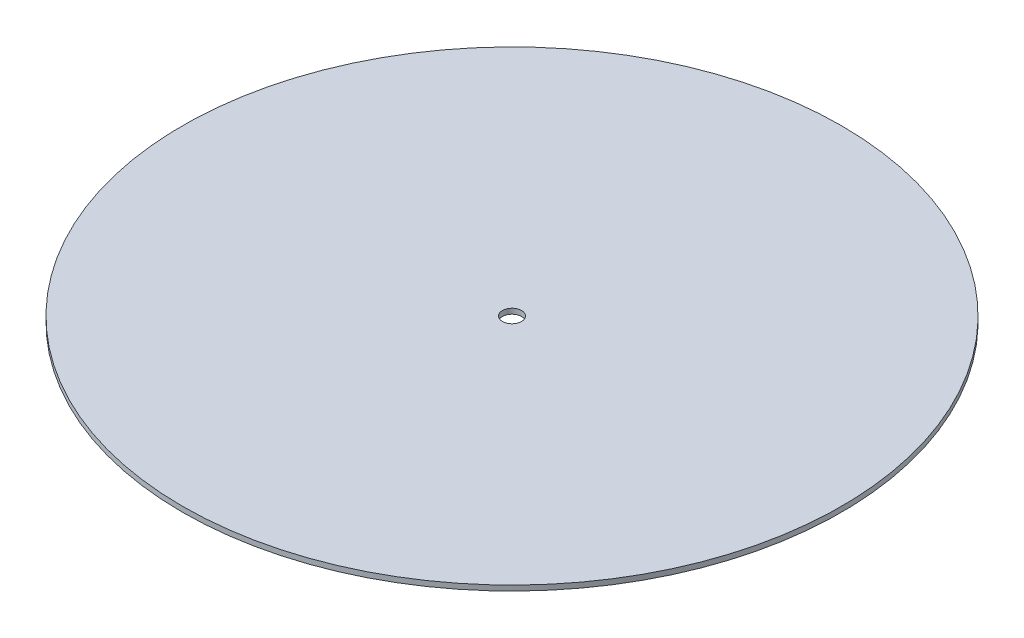
ISO-10303-21;
HEADER;
FILE_DESCRIPTION(('STEP AP214'),'2;1');
FILE_NAME('part.step','',(''),(''),'','','');
FILE_SCHEMA(('AUTOMOTIVE_DESIGN { 1 0 10303 214 1 1 1 1 }'));
ENDSEC;
DATA;
#1=APPLICATION_CONTEXT('core data for automotive mechanical design processes');
#2=APPLICATION_PROTOCOL_DEFINITION('international standard','automotive_design',2000,#1);
#3=PRODUCT_CONTEXT('',#1,'mechanical');
#4=PRODUCT('Part','Part','',(#3));
#5=PRODUCT_RELATED_PRODUCT_CATEGORY('part','',(#4));
#6=PRODUCT_DEFINITION_FORMATION('','',#4);
#7=PRODUCT_DEFINITION_CONTEXT('part definition',#1,'design');
#8=PRODUCT_DEFINITION('design','',#6,#7);
#9=PRODUCT_DEFINITION_SHAPE('','',#8);
#10=(LENGTH_UNIT() NAMED_UNIT(*) SI_UNIT(.MILLI.,.METRE.));
#11=(NAMED_UNIT(*) PLANE_ANGLE_UNIT() SI_UNIT($,.RADIAN.));
#12=(NAMED_UNIT(*) SI_UNIT($,.STERADIAN.) SOLID_ANGLE_UNIT());
#13=UNCERTAINTY_MEASURE_WITH_UNIT(LENGTH_MEASURE(1.E-05),#10,'distance_accuracy_value','');
#14=(GEOMETRIC_REPRESENTATION_CONTEXT(3) GLOBAL_UNCERTAINTY_ASSIGNED_CONTEXT((#13)) GLOBAL_UNIT_ASSIGNED_CONTEXT((#10,
#11,#12)) REPRESENTATION_CONTEXT('',''));
#15=CARTESIAN_POINT('',(0.,0.,0.));
#16=DIRECTION('',(0.,0.,1.));
#17=DIRECTION('',(1.,0.,0.));
#18=AXIS2_PLACEMENT_3D('',#15,#16,#17);
#19=CARTESIAN_POINT('',(0.,3.,0.));
#20=DIRECTION('',(0.,-1.,0.));
#21=DIRECTION('',(0.,0.,-1.));
#22=AXIS2_PLACEMENT_3D('',#19,#20,#21);
#23=CYLINDRICAL_SURFACE('',#22,190.);
#24=CARTESIAN_POINT('',(0.,3.,0.));
#25=DIRECTION('',(0.,1.,0.));
#26=DIRECTION('',(0.,0.,1.));
#27=AXIS2_PLACEMENT_3D('',#24,#25,#26);
#28=CIRCLE('',#27,190.);
#29=CARTESIAN_POINT('',(0.,3.,190.));
#30=VERTEX_POINT('',#29);
#31=EDGE_CURVE('E10',#30,#30,#28,.T.);
#32=ORIENTED_EDGE('',*,*,#31,.F.);
#33=EDGE_LOOP('',(#32));
#34=FACE_BOUND('',#33,.T.);
#35=CARTESIAN_POINT('',(0.,0.,0.));
#36=DIRECTION('',(0.,1.,0.));
#37=DIRECTION('',(0.,0.,1.));
#38=AXIS2_PLACEMENT_3D('',#35,#36,#37);
#39=CIRCLE('',#38,190.);
#40=CARTESIAN_POINT('',(0.,0.,190.));
#41=VERTEX_POINT('',#40);
#42=EDGE_CURVE('E36',#41,#41,#39,.T.);
#43=ORIENTED_EDGE('',*,*,#42,.T.);
#44=EDGE_LOOP('',(#43));
#45=FACE_BOUND('',#44,.T.);
#46=ADVANCED_FACE('F33',(#34,#45),#23,.T.);
#47=CARTESIAN_POINT('',(0.,3.,0.));
#48=DIRECTION('',(0.,1.,0.));
#49=DIRECTION('',(0.,0.,1.));
#50=AXIS2_PLACEMENT_3D('',#47,#48,#49);
#51=PLANE('',#50);
#52=CARTESIAN_POINT('',(0.,3.,0.));
#53=DIRECTION('',(0.,1.,0.));
#54=DIRECTION('',(0.,0.,1.));
#55=AXIS2_PLACEMENT_3D('',#52,#53,#54);
#56=CIRCLE('',#55,5.5);
#57=CARTESIAN_POINT('',(0.,3.,5.5));
#58=VERTEX_POINT('',#57);
#59=EDGE_CURVE('E47',#58,#58,#56,.T.);
#60=ORIENTED_EDGE('',*,*,#59,.F.);
#61=EDGE_LOOP('',(#60));
#62=FACE_BOUND('',#61,.T.);
#63=ORIENTED_EDGE('',*,*,#31,.T.);
#64=EDGE_LOOP('',(#63));
#65=FACE_BOUND('',#64,.T.);
#66=ADVANCED_FACE('F53',(#62,#65),#51,.T.);
#67=CARTESIAN_POINT('',(0.,0.,0.));
#68=DIRECTION('',(0.,1.,0.));
#69=DIRECTION('',(0.,0.,1.));
#70=AXIS2_PLACEMENT_3D('',#67,#68,#69);
#71=PLANE('',#70);
#72=CARTESIAN_POINT('',(0.,0.,0.));
#73=DIRECTION('',(0.,1.,0.));
#74=DIRECTION('',(0.,0.,1.));
#75=AXIS2_PLACEMENT_3D('',#72,#73,#74);
#76=CIRCLE('',#75,5.5);
#77=CARTESIAN_POINT('',(0.,0.,5.5));
#78=VERTEX_POINT('',#77);
#79=EDGE_CURVE('E43',#78,#78,#76,.T.);
#80=ORIENTED_EDGE('',*,*,#79,.T.);
#81=EDGE_LOOP('',(#80));
#82=FACE_BOUND('',#81,.T.);
#83=ORIENTED_EDGE('',*,*,#42,.F.);
#84=EDGE_LOOP('',(#83));
#85=FACE_BOUND('',#84,.T.);
#86=ADVANCED_FACE('F55',(#82,#85),#71,.F.);
#87=CARTESIAN_POINT('',(0.,3.,0.));
#88=DIRECTION('',(0.,1.,0.));
#89=DIRECTION('',(0.,0.,1.));
#90=AXIS2_PLACEMENT_3D('',#87,#88,#89);
#91=CYLINDRICAL_SURFACE('',#90,5.5);
#92=ORIENTED_EDGE('',*,*,#79,.F.);
#93=EDGE_LOOP('',(#92));
#94=FACE_BOUND('',#93,.T.);
#95=ORIENTED_EDGE('',*,*,#59,.T.);
#96=EDGE_LOOP('',(#95));
#97=FACE_BOUND('',#96,.T.);
#98=ADVANCED_FACE('F51',(#94,#97),#91,.F.);
#99=CLOSED_SHELL('',(#46,#66,#86,#98));
#100=MANIFOLD_SOLID_BREP('B2',#99);
#101=ADVANCED_BREP_SHAPE_REPRESENTATION('',(#18,#100),#14);
#102=SHAPE_DEFINITION_REPRESENTATION(#9,#101);
ENDSEC;
END-ISO-10303-21;
